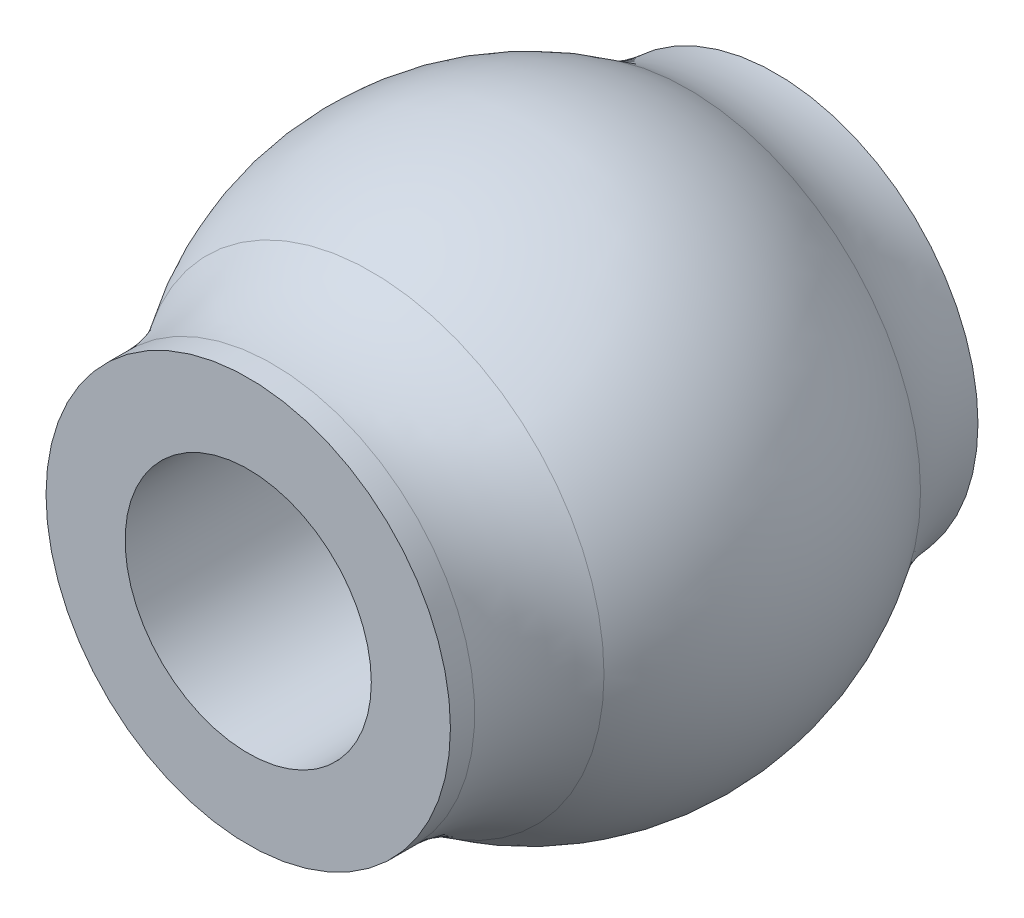
ISO-10303-21;
HEADER;
FILE_DESCRIPTION(('STEP AP214'),'2;1');
FILE_NAME('part.step','',(''),(''),'','','');
FILE_SCHEMA(('AUTOMOTIVE_DESIGN { 1 0 10303 214 1 1 1 1 }'));
ENDSEC;
DATA;
#1=APPLICATION_CONTEXT('core data for automotive mechanical design processes');
#2=APPLICATION_PROTOCOL_DEFINITION('international standard','automotive_design',2000,#1);
#3=PRODUCT_CONTEXT('',#1,'mechanical');
#4=PRODUCT('Part','Part','',(#3));
#5=PRODUCT_RELATED_PRODUCT_CATEGORY('part','',(#4));
#6=PRODUCT_DEFINITION_FORMATION('','',#4);
#7=PRODUCT_DEFINITION_CONTEXT('part definition',#1,'design');
#8=PRODUCT_DEFINITION('design','',#6,#7);
#9=PRODUCT_DEFINITION_SHAPE('','',#8);
#10=(LENGTH_UNIT() NAMED_UNIT(*) SI_UNIT(.MILLI.,.METRE.));
#11=(NAMED_UNIT(*) PLANE_ANGLE_UNIT() SI_UNIT($,.RADIAN.));
#12=(NAMED_UNIT(*) SI_UNIT($,.STERADIAN.) SOLID_ANGLE_UNIT());
#13=UNCERTAINTY_MEASURE_WITH_UNIT(LENGTH_MEASURE(1.E-05),#10,'distance_accuracy_value','');
#14=(GEOMETRIC_REPRESENTATION_CONTEXT(3) GLOBAL_UNCERTAINTY_ASSIGNED_CONTEXT((#13)) GLOBAL_UNIT_ASSIGNED_CONTEXT((#10,
#11,#12)) REPRESENTATION_CONTEXT('',''));
#15=CARTESIAN_POINT('',(0.,0.,0.));
#16=DIRECTION('',(0.,0.,1.));
#17=DIRECTION('',(1.,0.,0.));
#18=AXIS2_PLACEMENT_3D('',#15,#16,#17);
#19=CARTESIAN_POINT('',(6.,0.,2.5));
#20=DIRECTION('',(0.,0.,1.));
#21=DIRECTION('',(1.,0.,0.));
#22=AXIS2_PLACEMENT_3D('',#19,#20,#21);
#23=SPHERICAL_SURFACE('',#22,4.);
#24=CARTESIAN_POINT('',(6.,0.,0.245942589668641));
#25=DIRECTION('',(0.,0.,1.));
#26=DIRECTION('',(1.,0.,0.));
#27=AXIS2_PLACEMENT_3D('',#24,#25,#26);
#28=CIRCLE('',#27,3.30442509234667);
#29=CARTESIAN_POINT('',(9.30442509234667,0.,0.245942589668641));
#30=VERTEX_POINT('',#29);
#31=EDGE_CURVE('E37',#30,#30,#28,.T.);
#32=CARTESIAN_POINT('',(6.,0.,4.74926023341745));
#33=DIRECTION('',(0.,0.,-1.));
#34=DIRECTION('',(-1.,0.,0.));
#35=AXIS2_PLACEMENT_3D('',#32,#33,#34);
#36=CIRCLE('',#35,3.30769230769231);
#37=CARTESIAN_POINT('',(9.30769230769231,0.,4.74926023341745));
#38=VERTEX_POINT('',#37);
#39=EDGE_CURVE('E41',#38,#38,#36,.T.);
#40=CARTESIAN_POINT('',(9.30442509234667,0.,0.245942589668641));
#41=CARTESIAN_POINT('',(9.33250297789496,0.,0.287103654562292));
#42=CARTESIAN_POINT('',(9.35981100529518,0.,0.328789828534771));
#43=CARTESIAN_POINT('',(9.41285094926801,0.,0.413153097022438));
#44=CARTESIAN_POINT('',(9.43858286584063,0.,0.455830191537626));
#45=CARTESIAN_POINT('',(9.48843419362677,0.,0.542116003495767));
#46=CARTESIAN_POINT('',(9.5125536048403,0.,0.58572472093872));
#47=CARTESIAN_POINT('',(9.55914636859926,0.,0.673812809572377));
#48=CARTESIAN_POINT('',(9.58161972114468,0.,0.71829218076308));
#49=CARTESIAN_POINT('',(9.62488895464462,0.,0.808059491358355));
#50=CARTESIAN_POINT('',(9.64568483559913,0.,0.853347430762926));
#51=CARTESIAN_POINT('',(9.68557009758456,0.,0.944668636630644));
#52=CARTESIAN_POINT('',(9.70465947861547,0.,0.990701903093791));
#53=CARTESIAN_POINT('',(9.74110508386188,0.,1.08344948835578));
#54=CARTESIAN_POINT('',(9.75846130807737,0.,1.13016380715462));
#55=CARTESIAN_POINT('',(9.79141636584691,0.,1.22420826950095));
#56=CARTESIAN_POINT('',(9.80701519940095,0.,1.27153841304844));
#57=CARTESIAN_POINT('',(9.83643369503092,0.,1.36674843794127));
#58=CARTESIAN_POINT('',(9.85025335710684,0.,1.4146283192866));
#59=CARTESIAN_POINT('',(9.87609421343848,0.,1.51087096508844));
#60=CARTESIAN_POINT('',(9.88811540769419,0.,1.55923372954495));
#61=CARTESIAN_POINT('',(9.91034254318471,0.,1.65637461266977));
#62=CARTESIAN_POINT('',(9.92054848441951,0.,1.70515273133808));
#63=CARTESIAN_POINT('',(9.93913086332016,0.,1.80305621401837));
#64=CARTESIAN_POINT('',(9.94750730098601,0.,1.85218157803034));
#65=CARTESIAN_POINT('',(9.96241897673159,0.,1.95071095767392));
#66=CARTESIAN_POINT('',(9.96895421481131,0.,2.00011497330554));
#67=CARTESIAN_POINT('',(9.98017436623473,0.,2.09913267338254));
#68=CARTESIAN_POINT('',(9.98485927957845,0.,2.14874635782793));
#69=CARTESIAN_POINT('',(9.99237223998731,0.,2.24811411996633));
#70=CARTESIAN_POINT('',(9.99520028705247,0.,2.29786819765935));
#71=CARTESIAN_POINT('',(9.99899556610336,0.,2.39744727469578));
#72=CARTESIAN_POINT('',(9.99996279808908,0.,2.44727227403919));
#73=CARTESIAN_POINT('',(10.0000350964355,0.,2.54692362375133));
#74=CARTESIAN_POINT('',(9.99914016279617,0.,2.59674997412005));
#75=CARTESIAN_POINT('',(9.99548937948795,0.,2.69633445337127));
#76=CARTESIAN_POINT('',(9.99273352981906,0.,2.74609258225378));
#77=CARTESIAN_POINT('',(9.98536476244336,0.,2.84547114127866));
#78=CARTESIAN_POINT('',(9.98075184473656,0.,2.89509157142105));
#79=CARTESIAN_POINT('',(9.96967538230014,0.,2.99412544798053));
#80=CARTESIAN_POINT('',(9.96321183757052,0.,3.04353889439763));
#81=CARTESIAN_POINT('',(9.94844314613293,0.,3.14208980753247));
#82=CARTESIAN_POINT('',(9.94013799942495,0.,3.19122727425022));
#83=CARTESIAN_POINT('',(9.92169770050432,0.,3.28915761736334));
#84=CARTESIAN_POINT('',(9.91156254829165,0.,3.33795049375871));
#85=CARTESIAN_POINT('',(9.88947639006697,0.,3.43512352675274));
#86=CARTESIAN_POINT('',(9.87752538405496,0.,3.48350368335139));
#87=CARTESIAN_POINT('',(9.8518242054285,0.,3.57978372356795));
#88=CARTESIAN_POINT('',(9.83807403281405,0.,3.62768360718585));
#89=CARTESIAN_POINT('',(9.80879372029664,0.,3.72293621882514));
#90=CARTESIAN_POINT('',(9.79326358039368,0.,3.77028894684653));
#91=CARTESIAN_POINT('',(9.76044501819918,0.,3.86438112880704));
#92=CARTESIAN_POINT('',(9.74315659590764,0.,3.91112058274616));
#93=CARTESIAN_POINT('',(9.7068456081096,0.,4.00392095385985));
#94=CARTESIAN_POINT('',(9.68782304260312,0.,4.04998187103441));
#95=CARTESIAN_POINT('',(9.64807033197472,0.,4.14136085528394));
#96=CARTESIAN_POINT('',(9.6273401868528,0.,4.1866789223589));
#97=CARTESIAN_POINT('',(9.58420125353117,0.,4.27650892319967));
#98=CARTESIAN_POINT('',(9.56179246533146,0.,4.32102085696548));
#99=CARTESIAN_POINT('',(9.51532756865628,0.,4.40917646013847));
#100=CARTESIAN_POINT('',(9.49127146018082,0.,4.45282012954565));
#101=CARTESIAN_POINT('',(9.44154538776005,0.,4.53917818619888));
#102=CARTESIAN_POINT('',(9.41587542381474,0.,4.58189257344492));
#103=CARTESIAN_POINT('',(9.36295794890509,0.,4.66633271541394));
#104=CARTESIAN_POINT('',(9.33571043794075,0.,4.70805847013694));
#105=CARTESIAN_POINT('',(9.30769230769231,0.,4.74926023341745));
#106=B_SPLINE_CURVE_WITH_KNOTS('',3,(#40,#41,#42,#43,#44,#45,#46,#47,#48,#49,#50,#51,#52,#53,
#54,#55,#56,#57,#58,#59,#60,#61,#62,#63,#64,#65,#66,#67,#68,#69,#70,#71,#72,#73,#74,#75,#76,#77,
#78,#79,#80,#81,#82,#83,#84,#85,#86,#87,#88,#89,#90,#91,#92,#93,#94,#95,#96,#97,#98,#99,#100,
#101,#102,#103,#104,#105),.UNSPECIFIED.,.F.,.F.,(4,2,2,2,2,2,2,2,2,2,2,2,2,2,2,2,2,2,2,2,2,2,2,
2,2,2,2,2,2,2,2,2,4),(0.,0.149468368219236,0.29893673643847,0.448405104657706,0.597873472876941,
0.747341841096177,0.896810209315412,1.04627857753465,1.19574694575388,1.34521531397312,
1.49468368219235,1.64415205041159,1.79362041863082,1.94308878685006,2.09255715506929,
2.24202552328853,2.39149389150776,2.540962259727,2.69043062794624,2.83989899616547,
2.98936736438471,3.13883573260394,3.28830410082318,3.43777246904241,3.58724083726165,
3.73670920548088,3.88617757370012,4.03564594191935,4.18511431013859,4.33458267835782,
4.48405104657706,4.63351941479629,4.78298778301553),.UNSPECIFIED.);
#107=EDGE_CURVE('BSEAM30',#30,#38,#106,.T.);
#108=ORIENTED_EDGE('',*,*,#31,.T.);
#109=ORIENTED_EDGE('',*,*,#39,.T.);
#110=ORIENTED_EDGE('',*,*,#107,.T.);
#111=ORIENTED_EDGE('',*,*,#107,.F.);
#112=EDGE_LOOP('',(#108,#110,#109,#111));
#113=FACE_BOUND('',#112,.T.);
#114=ADVANCED_FACE('F30',(#113),#23,.T.);
#115=CARTESIAN_POINT('',(6.,0.,-1.00000000266087));
#116=DIRECTION('',(0.,0.,-1.));
#117=DIRECTION('',(-1.,0.,0.));
#118=AXIS2_PLACEMENT_3D('',#115,#116,#117);
#119=PLANE('',#118);
#120=CARTESIAN_POINT('',(6.,0.,-1.00000000266087));
#121=DIRECTION('',(0.,0.,-1.));
#122=DIRECTION('',(1.,0.,0.));
#123=AXIS2_PLACEMENT_3D('',#120,#121,#122);
#124=CIRCLE('',#123,1.75);
#125=CARTESIAN_POINT('',(7.75,0.,-1.00000000266087));
#126=VERTEX_POINT('',#125);
#127=EDGE_CURVE('E54',#126,#126,#124,.T.);
#128=ORIENTED_EDGE('',*,*,#127,.F.);
#129=EDGE_LOOP('',(#128));
#130=FACE_BOUND('',#129,.T.);
#131=CARTESIAN_POINT('',(6.,0.,-1.00000000266087));
#132=DIRECTION('',(0.,0.,-1.));
#133=DIRECTION('',(-1.,0.,0.));
#134=AXIS2_PLACEMENT_3D('',#131,#132,#133);
#135=CIRCLE('',#134,2.875);
#136=CARTESIAN_POINT('',(3.125,0.,-1.00000000266087));
#137=VERTEX_POINT('',#136);
#138=EDGE_CURVE('E45',#137,#137,#135,.T.);
#139=ORIENTED_EDGE('',*,*,#138,.T.);
#140=EDGE_LOOP('',(#139));
#141=FACE_BOUND('',#140,.T.);
#142=ADVANCED_FACE('F70',(#130,#141),#119,.T.);
#143=CARTESIAN_POINT('',(6.,0.,6.5));
#144=DIRECTION('',(0.,0.,-1.));
#145=DIRECTION('',(-1.,0.,0.));
#146=AXIS2_PLACEMENT_3D('',#143,#144,#145);
#147=CYLINDRICAL_SURFACE('',#146,2.875);
#148=CARTESIAN_POINT('',(6.,0.,6.15504787930336));
#149=DIRECTION('',(0.,0.,-1.));
#150=DIRECTION('',(-1.,0.,0.));
#151=AXIS2_PLACEMENT_3D('',#148,#149,#150);
#152=CIRCLE('',#151,2.875);
#153=CARTESIAN_POINT('',(3.125,0.,6.15504787930336));
#154=VERTEX_POINT('',#153);
#155=EDGE_CURVE('E10',#154,#154,#152,.F.);
#156=ORIENTED_EDGE('',*,*,#155,.T.);
#157=EDGE_LOOP('',(#156));
#158=FACE_BOUND('',#157,.T.);
#159=CARTESIAN_POINT('',(6.,0.,6.5));
#160=DIRECTION('',(0.,0.,1.));
#161=DIRECTION('',(1.,0.,0.));
#162=AXIS2_PLACEMENT_3D('',#159,#160,#161);
#163=CIRCLE('',#162,2.875);
#164=CARTESIAN_POINT('',(8.875,0.,6.5));
#165=VERTEX_POINT('',#164);
#166=EDGE_CURVE('E50',#165,#165,#163,.T.);
#167=ORIENTED_EDGE('',*,*,#166,.F.);
#168=EDGE_LOOP('',(#167));
#169=FACE_BOUND('',#168,.T.);
#170=ADVANCED_FACE('F73',(#158,#169),#147,.T.);
#171=CARTESIAN_POINT('',(6.,0.,6.5));
#172=DIRECTION('',(0.,0.,1.));
#173=DIRECTION('',(1.,0.,0.));
#174=AXIS2_PLACEMENT_3D('',#171,#172,#173);
#175=PLANE('',#174);
#176=CARTESIAN_POINT('',(6.,0.,6.5));
#177=DIRECTION('',(0.,0.,-1.));
#178=DIRECTION('',(1.,0.,0.));
#179=AXIS2_PLACEMENT_3D('',#176,#177,#178);
#180=CIRCLE('',#179,1.75);
#181=CARTESIAN_POINT('',(7.75,0.,6.5));
#182=VERTEX_POINT('',#181);
#183=EDGE_CURVE('E53',#182,#182,#180,.T.);
#184=ORIENTED_EDGE('',*,*,#183,.T.);
#185=EDGE_LOOP('',(#184));
#186=FACE_BOUND('',#185,.T.);
#187=ORIENTED_EDGE('',*,*,#166,.T.);
#188=EDGE_LOOP('',(#187));
#189=FACE_BOUND('',#188,.T.);
#190=ADVANCED_FACE('F60',(#186,#189),#175,.T.);
#191=CARTESIAN_POINT('',(6.,0.,6.5));
#192=DIRECTION('',(0.,0.,-1.));
#193=DIRECTION('',(-1.,0.,0.));
#194=AXIS2_PLACEMENT_3D('',#191,#192,#193);
#195=CYLINDRICAL_SURFACE('',#194,1.75);
#196=ORIENTED_EDGE('',*,*,#183,.F.);
#197=EDGE_LOOP('',(#196));
#198=FACE_BOUND('',#197,.T.);
#199=ORIENTED_EDGE('',*,*,#127,.T.);
#200=EDGE_LOOP('',(#199));
#201=FACE_BOUND('',#200,.T.);
#202=ADVANCED_FACE('F63',(#198,#201),#195,.F.);
#203=CARTESIAN_POINT('',(6.,0.,-1.16284329178846));
#204=DIRECTION('',(0.,0.,1.));
#205=DIRECTION('',(1.,0.,0.));
#206=AXIS2_PLACEMENT_3D('',#203,#204,#205);
#207=TOROIDAL_SURFACE('',#206,5.36969077506334,2.5);
#208=ORIENTED_EDGE('',*,*,#31,.F.);
#209=EDGE_LOOP('',(#208));
#210=FACE_BOUND('',#209,.T.);
#211=ORIENTED_EDGE('',*,*,#138,.F.);
#212=EDGE_LOOP('',(#211));
#213=FACE_BOUND('',#212,.T.);
#214=ADVANCED_FACE('F66',(#210,#213),#207,.F.);
#215=CARTESIAN_POINT('',(6.,0.,6.15504787930336));
#216=DIRECTION('',(0.,0.,-1.));
#217=DIRECTION('',(-1.,0.,0.));
#218=AXIS2_PLACEMENT_3D('',#215,#216,#217);
#219=TOROIDAL_SURFACE('',#218,5.375,2.5);
#220=ORIENTED_EDGE('',*,*,#39,.F.);
#221=EDGE_LOOP('',(#220));
#222=FACE_BOUND('',#221,.T.);
#223=ORIENTED_EDGE('',*,*,#155,.F.);
#224=EDGE_LOOP('',(#223));
#225=FACE_BOUND('',#224,.T.);
#226=ADVANCED_FACE('F32',(#222,#225),#219,.F.);
#227=CLOSED_SHELL('',(#114,#142,#170,#190,#202,#214,#226));
#228=MANIFOLD_SOLID_BREP('B2',#227);
#229=ADVANCED_BREP_SHAPE_REPRESENTATION('',(#18,#228),#14);
#230=SHAPE_DEFINITION_REPRESENTATION(#9,#229);
ENDSEC;
END-ISO-10303-21;
